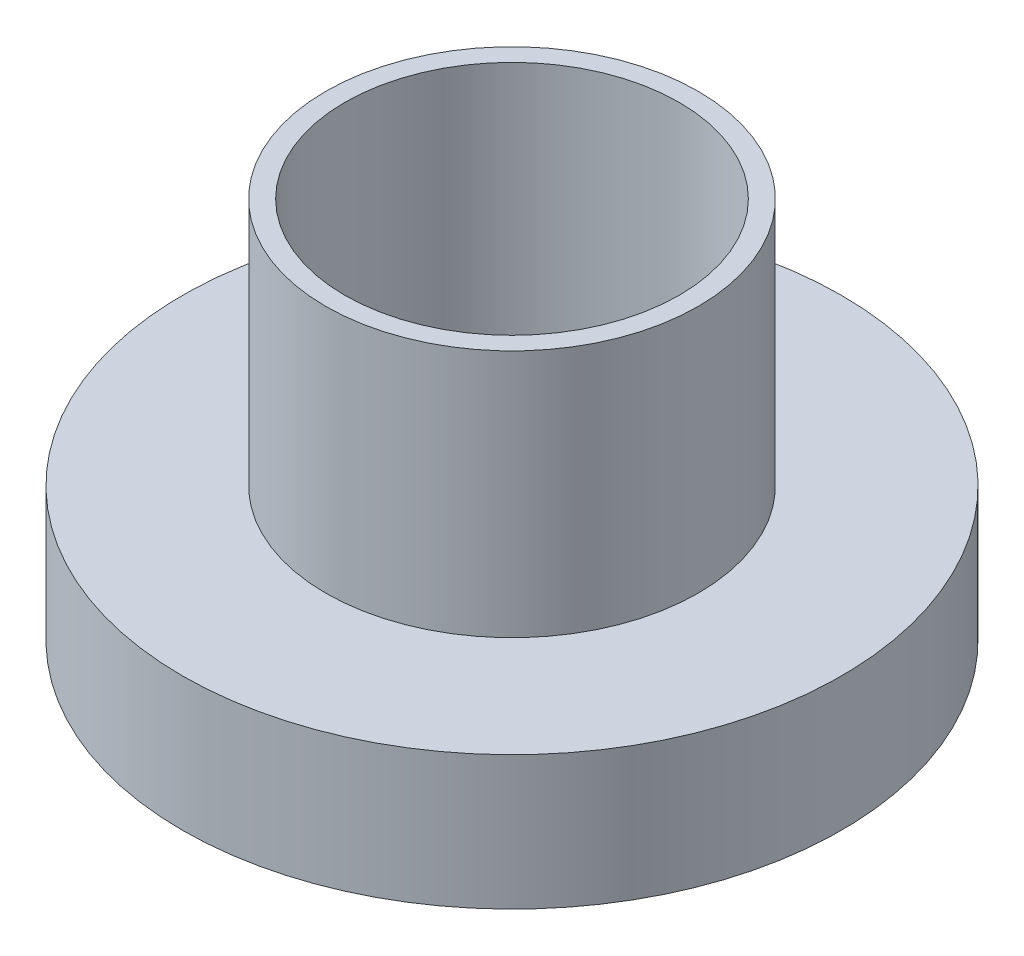
ISO-10303-21;
HEADER;
FILE_DESCRIPTION(('STEP AP214'),'2;1');
FILE_NAME('part.step','',(''),(''),'','','');
FILE_SCHEMA(('AUTOMOTIVE_DESIGN { 1 0 10303 214 1 1 1 1 }'));
ENDSEC;
DATA;
#1=APPLICATION_CONTEXT('core data for automotive mechanical design processes');
#2=APPLICATION_PROTOCOL_DEFINITION('international standard','automotive_design',2000,#1);
#3=PRODUCT_CONTEXT('',#1,'mechanical');
#4=PRODUCT('Part','Part','',(#3));
#5=PRODUCT_RELATED_PRODUCT_CATEGORY('part','',(#4));
#6=PRODUCT_DEFINITION_FORMATION('','',#4);
#7=PRODUCT_DEFINITION_CONTEXT('part definition',#1,'design');
#8=PRODUCT_DEFINITION('design','',#6,#7);
#9=PRODUCT_DEFINITION_SHAPE('','',#8);
#10=(LENGTH_UNIT() NAMED_UNIT(*) SI_UNIT(.MILLI.,.METRE.));
#11=(NAMED_UNIT(*) PLANE_ANGLE_UNIT() SI_UNIT($,.RADIAN.));
#12=(NAMED_UNIT(*) SI_UNIT($,.STERADIAN.) SOLID_ANGLE_UNIT());
#13=UNCERTAINTY_MEASURE_WITH_UNIT(LENGTH_MEASURE(1.E-05),#10,'distance_accuracy_value','');
#14=(GEOMETRIC_REPRESENTATION_CONTEXT(3) GLOBAL_UNCERTAINTY_ASSIGNED_CONTEXT((#13)) GLOBAL_UNIT_ASSIGNED_CONTEXT((#10,
#11,#12)) REPRESENTATION_CONTEXT('',''));
#15=CARTESIAN_POINT('',(0.,0.,0.));
#16=DIRECTION('',(0.,0.,1.));
#17=DIRECTION('',(1.,0.,0.));
#18=AXIS2_PLACEMENT_3D('',#15,#16,#17);
#19=CARTESIAN_POINT('',(19.5,14.,0.));
#20=DIRECTION('',(0.,1.,0.));
#21=DIRECTION('',(0.,0.,1.));
#22=AXIS2_PLACEMENT_3D('',#19,#20,#21);
#23=PLANE('',#22);
#24=CARTESIAN_POINT('',(0.,14.,0.));
#25=DIRECTION('',(0.,-1.,0.));
#26=DIRECTION('',(0.,0.,-1.));
#27=AXIS2_PLACEMENT_3D('',#24,#25,#26);
#28=CIRCLE('',#27,19.5);
#29=CARTESIAN_POINT('',(0.,14.,-19.5));
#30=VERTEX_POINT('',#29);
#31=EDGE_CURVE('E10',#30,#30,#28,.T.);
#32=ORIENTED_EDGE('',*,*,#31,.T.);
#33=EDGE_LOOP('',(#32));
#34=FACE_BOUND('',#33,.T.);
#35=CARTESIAN_POINT('',(0.,14.,0.));
#36=DIRECTION('',(0.,-1.,0.));
#37=DIRECTION('',(0.,0.,-1.));
#38=AXIS2_PLACEMENT_3D('',#35,#36,#37);
#39=CIRCLE('',#38,34.5);
#40=CARTESIAN_POINT('',(0.,14.,-34.5));
#41=VERTEX_POINT('',#40);
#42=EDGE_CURVE('E59',#41,#41,#39,.T.);
#43=ORIENTED_EDGE('',*,*,#42,.F.);
#44=EDGE_LOOP('',(#43));
#45=FACE_BOUND('',#44,.T.);
#46=ADVANCED_FACE('F37',(#34,#45),#23,.T.);
#47=CARTESIAN_POINT('',(0.,0.,0.));
#48=DIRECTION('',(0.,-1.,0.));
#49=DIRECTION('',(0.,0.,-1.));
#50=AXIS2_PLACEMENT_3D('',#47,#48,#49);
#51=CYLINDRICAL_SURFACE('',#50,19.5);
#52=CARTESIAN_POINT('',(0.,40.,0.));
#53=DIRECTION('',(0.,-1.,0.));
#54=DIRECTION('',(0.,0.,-1.));
#55=AXIS2_PLACEMENT_3D('',#52,#53,#54);
#56=CIRCLE('',#55,19.5);
#57=CARTESIAN_POINT('',(0.,40.,-19.5));
#58=VERTEX_POINT('',#57);
#59=EDGE_CURVE('E43',#58,#58,#56,.T.);
#60=ORIENTED_EDGE('',*,*,#59,.T.);
#61=EDGE_LOOP('',(#60));
#62=FACE_BOUND('',#61,.T.);
#63=ORIENTED_EDGE('',*,*,#31,.F.);
#64=EDGE_LOOP('',(#63));
#65=FACE_BOUND('',#64,.T.);
#66=ADVANCED_FACE('F67',(#62,#65),#51,.T.);
#67=CARTESIAN_POINT('',(17.5,40.,0.));
#68=DIRECTION('',(0.,1.,0.));
#69=DIRECTION('',(0.,0.,1.));
#70=AXIS2_PLACEMENT_3D('',#67,#68,#69);
#71=PLANE('',#70);
#72=CARTESIAN_POINT('',(0.,40.,0.));
#73=DIRECTION('',(0.,-1.,0.));
#74=DIRECTION('',(0.,0.,-1.));
#75=AXIS2_PLACEMENT_3D('',#72,#73,#74);
#76=CIRCLE('',#75,17.5);
#77=CARTESIAN_POINT('',(0.,40.,-17.5));
#78=VERTEX_POINT('',#77);
#79=EDGE_CURVE('E47',#78,#78,#76,.T.);
#80=ORIENTED_EDGE('',*,*,#79,.T.);
#81=EDGE_LOOP('',(#80));
#82=FACE_BOUND('',#81,.T.);
#83=ORIENTED_EDGE('',*,*,#59,.F.);
#84=EDGE_LOOP('',(#83));
#85=FACE_BOUND('',#84,.T.);
#86=ADVANCED_FACE('F71',(#82,#85),#71,.T.);
#87=CARTESIAN_POINT('',(0.,0.,0.));
#88=DIRECTION('',(0.,-1.,0.));
#89=DIRECTION('',(0.,0.,-1.));
#90=AXIS2_PLACEMENT_3D('',#87,#88,#89);
#91=CYLINDRICAL_SURFACE('',#90,17.5);
#92=CARTESIAN_POINT('',(0.,9.81495457622366,0.));
#93=DIRECTION('',(0.,-1.,0.));
#94=DIRECTION('',(0.,0.,-1.));
#95=AXIS2_PLACEMENT_3D('',#92,#93,#94);
#96=CIRCLE('',#95,17.5);
#97=CARTESIAN_POINT('',(0.,9.81495457622366,-17.5));
#98=VERTEX_POINT('',#97);
#99=EDGE_CURVE('E51',#98,#98,#96,.T.);
#100=ORIENTED_EDGE('',*,*,#99,.T.);
#101=EDGE_LOOP('',(#100));
#102=FACE_BOUND('',#101,.T.);
#103=ORIENTED_EDGE('',*,*,#79,.F.);
#104=EDGE_LOOP('',(#103));
#105=FACE_BOUND('',#104,.T.);
#106=ADVANCED_FACE('F75',(#102,#105),#91,.F.);
#107=CARTESIAN_POINT('',(0.,9.81495457622366,0.));
#108=DIRECTION('',(0.,-1.,0.));
#109=DIRECTION('',(0.,0.,-1.));
#110=AXIS2_PLACEMENT_3D('',#107,#108,#109);
#111=CONICAL_SURFACE('',#110,17.5,1.0471975511966);
#112=CARTESIAN_POINT('',(0.,0.,0.));
#113=DIRECTION('',(0.,-1.,0.));
#114=DIRECTION('',(0.,0.,-1.));
#115=AXIS2_PLACEMENT_3D('',#112,#113,#114);
#116=CIRCLE('',#115,34.5);
#117=CARTESIAN_POINT('',(0.,0.,-34.5));
#118=VERTEX_POINT('',#117);
#119=EDGE_CURVE('E56',#118,#118,#116,.T.);
#120=ORIENTED_EDGE('',*,*,#119,.T.);
#121=EDGE_LOOP('',(#120));
#122=FACE_BOUND('',#121,.T.);
#123=ORIENTED_EDGE('',*,*,#99,.F.);
#124=EDGE_LOOP('',(#123));
#125=FACE_BOUND('',#124,.T.);
#126=ADVANCED_FACE('F82',(#122,#125),#111,.F.);
#127=CARTESIAN_POINT('',(0.,0.,0.));
#128=DIRECTION('',(0.,-1.,0.));
#129=DIRECTION('',(0.,0.,-1.));
#130=AXIS2_PLACEMENT_3D('',#127,#128,#129);
#131=CYLINDRICAL_SURFACE('',#130,34.5);
#132=ORIENTED_EDGE('',*,*,#42,.T.);
#133=EDGE_LOOP('',(#132));
#134=FACE_BOUND('',#133,.T.);
#135=ORIENTED_EDGE('',*,*,#119,.F.);
#136=EDGE_LOOP('',(#135));
#137=FACE_BOUND('',#136,.T.);
#138=ADVANCED_FACE('F63',(#134,#137),#131,.T.);
#139=CLOSED_SHELL('',(#46,#66,#86,#106,#126,#138));
#140=MANIFOLD_SOLID_BREP('B2',#139);
#141=ADVANCED_BREP_SHAPE_REPRESENTATION('',(#18,#140),#14);
#142=SHAPE_DEFINITION_REPRESENTATION(#9,#141);
ENDSEC;
END-ISO-10303-21;
